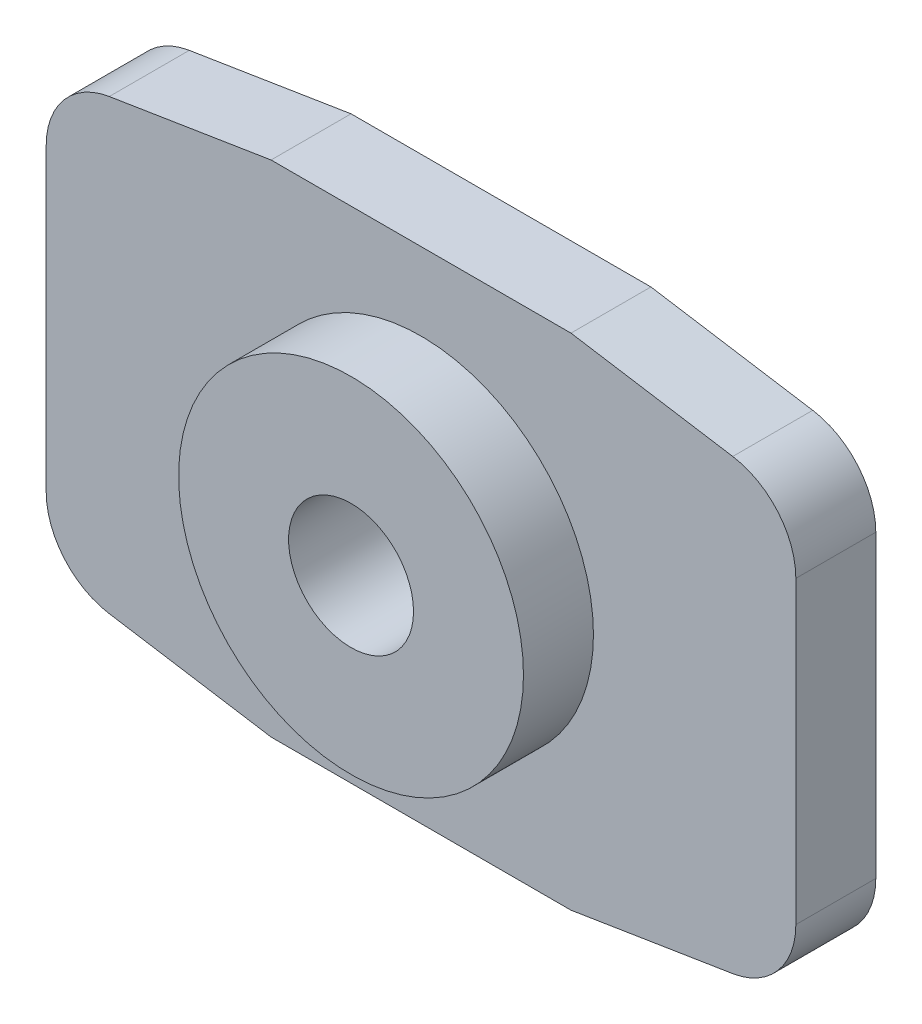
ISO-10303-21;
HEADER;
FILE_DESCRIPTION(('STEP AP214'),'2;1');
FILE_NAME('part.step','',(''),(''),'','','');
FILE_SCHEMA(('AUTOMOTIVE_DESIGN { 1 0 10303 214 1 1 1 1 }'));
ENDSEC;
DATA;
#1=APPLICATION_CONTEXT('core data for automotive mechanical design processes');
#2=APPLICATION_PROTOCOL_DEFINITION('international standard','automotive_design',2000,#1);
#3=PRODUCT_CONTEXT('',#1,'mechanical');
#4=PRODUCT('Part','Part','',(#3));
#5=PRODUCT_RELATED_PRODUCT_CATEGORY('part','',(#4));
#6=PRODUCT_DEFINITION_FORMATION('','',#4);
#7=PRODUCT_DEFINITION_CONTEXT('part definition',#1,'design');
#8=PRODUCT_DEFINITION('design','',#6,#7);
#9=PRODUCT_DEFINITION_SHAPE('','',#8);
#10=(LENGTH_UNIT() NAMED_UNIT(*) SI_UNIT(.MILLI.,.METRE.));
#11=(NAMED_UNIT(*) PLANE_ANGLE_UNIT() SI_UNIT($,.RADIAN.));
#12=(NAMED_UNIT(*) SI_UNIT($,.STERADIAN.) SOLID_ANGLE_UNIT());
#13=UNCERTAINTY_MEASURE_WITH_UNIT(LENGTH_MEASURE(1.E-05),#10,'distance_accuracy_value','');
#14=(GEOMETRIC_REPRESENTATION_CONTEXT(3) GLOBAL_UNCERTAINTY_ASSIGNED_CONTEXT((#13)) GLOBAL_UNIT_ASSIGNED_CONTEXT((#10,
#11,#12)) REPRESENTATION_CONTEXT('',''));
#15=CARTESIAN_POINT('',(0.,0.,0.));
#16=DIRECTION('',(0.,0.,1.));
#17=DIRECTION('',(1.,0.,0.));
#18=AXIS2_PLACEMENT_3D('',#15,#16,#17);
#19=CARTESIAN_POINT('',(6.,3.,1.6));
#20=DIRECTION('',(0.,0.,1.));
#21=DIRECTION('',(1.,0.,0.));
#22=AXIS2_PLACEMENT_3D('',#19,#20,#21);
#23=PLANE('',#22);
#24=CARTESIAN_POINT('',(6.,3.,1.6));
#25=DIRECTION('',(0.,0.,1.));
#26=DIRECTION('',(1.,0.,0.));
#27=AXIS2_PLACEMENT_3D('',#24,#25,#26);
#28=CIRCLE('',#27,1.5);
#29=CARTESIAN_POINT('',(7.5,3.,1.6));
#30=VERTEX_POINT('',#29);
#31=CARTESIAN_POINT('',(6.23739675280407,4.48109512920611,1.6));
#32=VERTEX_POINT('',#31);
#33=EDGE_CURVE('E185',#30,#32,#28,.T.);
#34=ORIENTED_EDGE('',*,*,#33,.T.);
#35=DIRECTION('',(-0.987396752804077,0.158264501869385,0.));
#36=VECTOR('',#35,1.);
#37=CARTESIAN_POINT('',(6.23739675280407,4.48109512920611,1.6));
#38=LINE('',#37,#36);
#39=CARTESIAN_POINT('',(3.,5.,1.6));
#40=VERTEX_POINT('',#39);
#41=EDGE_CURVE('E113',#32,#40,#38,.T.);
#42=ORIENTED_EDGE('',*,*,#41,.T.);
#43=DIRECTION('',(-1.,0.,0.));
#44=VECTOR('',#43,1.);
#45=CARTESIAN_POINT('',(-3.,5.,1.6));
#46=LINE('',#45,#44);
#47=CARTESIAN_POINT('',(-3.,5.,1.6));
#48=VERTEX_POINT('',#47);
#49=EDGE_CURVE('E212',#40,#48,#46,.T.);
#50=ORIENTED_EDGE('',*,*,#49,.T.);
#51=DIRECTION('',(-0.987396752804077,-0.158264501869386,0.));
#52=VECTOR('',#51,1.);
#53=CARTESIAN_POINT('',(-6.23739675280407,4.48109512920611,1.6));
#54=LINE('',#53,#52);
#55=CARTESIAN_POINT('',(-6.23739675280407,4.48109512920611,1.6));
#56=VERTEX_POINT('',#55);
#57=EDGE_CURVE('E230',#48,#56,#54,.T.);
#58=ORIENTED_EDGE('',*,*,#57,.T.);
#59=CARTESIAN_POINT('',(-6.,3.,1.6));
#60=DIRECTION('',(0.,0.,1.));
#61=DIRECTION('',(-1.,0.,0.));
#62=AXIS2_PLACEMENT_3D('',#59,#60,#61);
#63=CIRCLE('',#62,1.5);
#64=CARTESIAN_POINT('',(-7.5,3.,1.6));
#65=VERTEX_POINT('',#64);
#66=EDGE_CURVE('E227',#56,#65,#63,.T.);
#67=ORIENTED_EDGE('',*,*,#66,.T.);
#68=DIRECTION('',(0.,-1.,0.));
#69=VECTOR('',#68,1.);
#70=CARTESIAN_POINT('',(-7.5,-3.,1.6));
#71=LINE('',#70,#69);
#72=CARTESIAN_POINT('',(-7.5,-3.,1.6));
#73=VERTEX_POINT('',#72);
#74=EDGE_CURVE('E229',#65,#73,#71,.T.);
#75=ORIENTED_EDGE('',*,*,#74,.T.);
#76=CARTESIAN_POINT('',(-6.,-3.,1.6));
#77=DIRECTION('',(0.,0.,1.));
#78=DIRECTION('',(1.,0.,0.));
#79=AXIS2_PLACEMENT_3D('',#76,#77,#78);
#80=CIRCLE('',#79,1.5);
#81=CARTESIAN_POINT('',(-6.23739675280407,-4.48109512920612,1.6));
#82=VERTEX_POINT('',#81);
#83=EDGE_CURVE('E232',#73,#82,#80,.T.);
#84=ORIENTED_EDGE('',*,*,#83,.T.);
#85=DIRECTION('',(0.987396752804077,-0.158264501869385,0.));
#86=VECTOR('',#85,1.);
#87=CARTESIAN_POINT('',(-6.23739675280407,-4.48109512920612,1.6));
#88=LINE('',#87,#86);
#89=CARTESIAN_POINT('',(-3.,-5.,1.6));
#90=VERTEX_POINT('',#89);
#91=EDGE_CURVE('E238',#82,#90,#88,.T.);
#92=ORIENTED_EDGE('',*,*,#91,.T.);
#93=DIRECTION('',(1.,0.,0.));
#94=VECTOR('',#93,1.);
#95=CARTESIAN_POINT('',(-3.,-5.,1.6));
#96=LINE('',#95,#94);
#97=CARTESIAN_POINT('',(3.,-5.,1.6));
#98=VERTEX_POINT('',#97);
#99=EDGE_CURVE('E144',#90,#98,#96,.T.);
#100=ORIENTED_EDGE('',*,*,#99,.T.);
#101=DIRECTION('',(0.987396752804077,0.158264501869385,0.));
#102=VECTOR('',#101,1.);
#103=CARTESIAN_POINT('',(6.23739675280407,-4.48109512920611,1.6));
#104=LINE('',#103,#102);
#105=CARTESIAN_POINT('',(6.23739675280407,-4.48109512920612,1.6));
#106=VERTEX_POINT('',#105);
#107=EDGE_CURVE('E138',#98,#106,#104,.T.);
#108=ORIENTED_EDGE('',*,*,#107,.T.);
#109=CARTESIAN_POINT('',(6.,-3.,1.6));
#110=DIRECTION('',(0.,0.,1.));
#111=DIRECTION('',(-1.,0.,0.));
#112=AXIS2_PLACEMENT_3D('',#109,#110,#111);
#113=CIRCLE('',#112,1.5);
#114=CARTESIAN_POINT('',(7.5,-3.,1.6));
#115=VERTEX_POINT('',#114);
#116=EDGE_CURVE('E142',#106,#115,#113,.T.);
#117=ORIENTED_EDGE('',*,*,#116,.T.);
#118=DIRECTION('',(0.,1.,0.));
#119=VECTOR('',#118,1.);
#120=CARTESIAN_POINT('',(7.5,-3.,1.6));
#121=LINE('',#120,#119);
#122=EDGE_CURVE('E58',#115,#30,#121,.T.);
#123=ORIENTED_EDGE('',*,*,#122,.T.);
#124=EDGE_LOOP('',(#34,#42,#50,#58,#67,#75,#84,#92,#100,#108,#117,#123));
#125=FACE_BOUND('',#124,.T.);
#126=CARTESIAN_POINT('',(0.,0.,1.6));
#127=DIRECTION('',(0.,0.,1.));
#128=DIRECTION('',(1.,0.,0.));
#129=AXIS2_PLACEMENT_3D('',#126,#127,#128);
#130=CIRCLE('',#129,3.45);
#131=CARTESIAN_POINT('',(3.45,0.,1.6));
#132=VERTEX_POINT('',#131);
#133=EDGE_CURVE('E290',#132,#132,#130,.T.);
#134=ORIENTED_EDGE('',*,*,#133,.F.);
#135=EDGE_LOOP('',(#134));
#136=FACE_BOUND('',#135,.T.);
#137=ADVANCED_FACE('F41',(#125,#136),#23,.T.);
#138=CARTESIAN_POINT('',(6.,3.,1.6));
#139=DIRECTION('',(0.,0.,-1.));
#140=DIRECTION('',(-1.,0.,0.));
#141=AXIS2_PLACEMENT_3D('',#138,#139,#140);
#142=CYLINDRICAL_SURFACE('',#141,1.5);
#143=CARTESIAN_POINT('',(6.,3.,0.));
#144=DIRECTION('',(0.,0.,1.));
#145=DIRECTION('',(1.,0.,0.));
#146=AXIS2_PLACEMENT_3D('',#143,#144,#145);
#147=CIRCLE('',#146,1.5);
#148=CARTESIAN_POINT('',(7.5,3.,0.));
#149=VERTEX_POINT('',#148);
#150=CARTESIAN_POINT('',(6.23739675280407,4.48109512920611,0.));
#151=VERTEX_POINT('',#150);
#152=EDGE_CURVE('E162',#149,#151,#147,.T.);
#153=ORIENTED_EDGE('',*,*,#152,.T.);
#154=DIRECTION('',(0.,0.,-1.));
#155=VECTOR('',#154,1.);
#156=CARTESIAN_POINT('',(6.23739675280407,4.48109512920611,1.6));
#157=LINE('',#156,#155);
#158=EDGE_CURVE('E11',#32,#151,#157,.T.);
#159=ORIENTED_EDGE('',*,*,#158,.F.);
#160=ORIENTED_EDGE('',*,*,#33,.F.);
#161=DIRECTION('',(0.,0.,-1.));
#162=VECTOR('',#161,1.);
#163=CARTESIAN_POINT('',(7.5,3.,1.6));
#164=LINE('',#163,#162);
#165=EDGE_CURVE('E158',#30,#149,#164,.T.);
#166=ORIENTED_EDGE('',*,*,#165,.T.);
#167=EDGE_LOOP('',(#153,#159,#160,#166));
#168=FACE_BOUND('',#167,.T.);
#169=ADVANCED_FACE('F43',(#168),#142,.T.);
#170=CARTESIAN_POINT('',(6.23739675280407,4.48109512920611,1.6));
#171=DIRECTION('',(-0.158264501869385,-0.987396752804077,0.));
#172=DIRECTION('',(0.987396752804077,-0.158264501869385,0.));
#173=AXIS2_PLACEMENT_3D('',#170,#171,#172);
#174=PLANE('',#173);
#175=DIRECTION('',(-0.987396752804077,0.158264501869385,0.));
#176=VECTOR('',#175,1.);
#177=CARTESIAN_POINT('',(6.23739675280407,4.48109512920611,0.));
#178=LINE('',#177,#176);
#179=CARTESIAN_POINT('',(3.,5.,0.));
#180=VERTEX_POINT('',#179);
#181=EDGE_CURVE('E165',#151,#180,#178,.T.);
#182=ORIENTED_EDGE('',*,*,#181,.T.);
#183=DIRECTION('',(0.,0.,-1.));
#184=VECTOR('',#183,1.);
#185=CARTESIAN_POINT('',(3.,5.,1.6));
#186=LINE('',#185,#184);
#187=EDGE_CURVE('E50',#40,#180,#186,.T.);
#188=ORIENTED_EDGE('',*,*,#187,.F.);
#189=ORIENTED_EDGE('',*,*,#41,.F.);
#190=ORIENTED_EDGE('',*,*,#158,.T.);
#191=EDGE_LOOP('',(#182,#188,#189,#190));
#192=FACE_BOUND('',#191,.T.);
#193=ADVANCED_FACE('F269',(#192),#174,.F.);
#194=CARTESIAN_POINT('',(-3.,5.,1.6));
#195=DIRECTION('',(0.,-1.,0.));
#196=DIRECTION('',(0.,0.,-1.));
#197=AXIS2_PLACEMENT_3D('',#194,#195,#196);
#198=PLANE('',#197);
#199=DIRECTION('',(-1.,0.,0.));
#200=VECTOR('',#199,1.);
#201=CARTESIAN_POINT('',(-3.,5.,0.));
#202=LINE('',#201,#200);
#203=CARTESIAN_POINT('',(-3.,5.,0.));
#204=VERTEX_POINT('',#203);
#205=EDGE_CURVE('E168',#180,#204,#202,.T.);
#206=ORIENTED_EDGE('',*,*,#205,.T.);
#207=DIRECTION('',(0.,0.,-1.));
#208=VECTOR('',#207,1.);
#209=CARTESIAN_POINT('',(-3.,5.,1.6));
#210=LINE('',#209,#208);
#211=EDGE_CURVE('E204',#48,#204,#210,.T.);
#212=ORIENTED_EDGE('',*,*,#211,.F.);
#213=ORIENTED_EDGE('',*,*,#49,.F.);
#214=ORIENTED_EDGE('',*,*,#187,.T.);
#215=EDGE_LOOP('',(#206,#212,#213,#214));
#216=FACE_BOUND('',#215,.T.);
#217=ADVANCED_FACE('F210',(#216),#198,.F.);
#218=CARTESIAN_POINT('',(-6.23739675280407,4.48109512920611,1.6));
#219=DIRECTION('',(0.158264501869386,-0.987396752804077,0.));
#220=DIRECTION('',(0.987396752804077,0.158264501869386,0.));
#221=AXIS2_PLACEMENT_3D('',#218,#219,#220);
#222=PLANE('',#221);
#223=DIRECTION('',(-0.987396752804077,-0.158264501869386,0.));
#224=VECTOR('',#223,1.);
#225=CARTESIAN_POINT('',(-6.23739675280407,4.48109512920611,0.));
#226=LINE('',#225,#224);
#227=CARTESIAN_POINT('',(-6.23739675280407,4.48109512920611,0.));
#228=VERTEX_POINT('',#227);
#229=EDGE_CURVE('E170',#204,#228,#226,.T.);
#230=ORIENTED_EDGE('',*,*,#229,.T.);
#231=DIRECTION('',(0.,0.,-1.));
#232=VECTOR('',#231,1.);
#233=CARTESIAN_POINT('',(-6.23739675280407,4.48109512920611,1.6));
#234=LINE('',#233,#232);
#235=EDGE_CURVE('E201',#56,#228,#234,.T.);
#236=ORIENTED_EDGE('',*,*,#235,.F.);
#237=ORIENTED_EDGE('',*,*,#57,.F.);
#238=ORIENTED_EDGE('',*,*,#211,.T.);
#239=EDGE_LOOP('',(#230,#236,#237,#238));
#240=FACE_BOUND('',#239,.T.);
#241=ADVANCED_FACE('F221',(#240),#222,.F.);
#242=CARTESIAN_POINT('',(-6.,3.,1.6));
#243=DIRECTION('',(0.,0.,-1.));
#244=DIRECTION('',(-1.,0.,0.));
#245=AXIS2_PLACEMENT_3D('',#242,#243,#244);
#246=CYLINDRICAL_SURFACE('',#245,1.5);
#247=CARTESIAN_POINT('',(-6.,3.,0.));
#248=DIRECTION('',(0.,0.,1.));
#249=DIRECTION('',(-1.,0.,0.));
#250=AXIS2_PLACEMENT_3D('',#247,#248,#249);
#251=CIRCLE('',#250,1.5);
#252=CARTESIAN_POINT('',(-7.5,3.,0.));
#253=VERTEX_POINT('',#252);
#254=EDGE_CURVE('E172',#228,#253,#251,.T.);
#255=ORIENTED_EDGE('',*,*,#254,.T.);
#256=DIRECTION('',(0.,0.,-1.));
#257=VECTOR('',#256,1.);
#258=CARTESIAN_POINT('',(-7.5,3.,1.6));
#259=LINE('',#258,#257);
#260=EDGE_CURVE('E198',#65,#253,#259,.T.);
#261=ORIENTED_EDGE('',*,*,#260,.F.);
#262=ORIENTED_EDGE('',*,*,#66,.F.);
#263=ORIENTED_EDGE('',*,*,#235,.T.);
#264=EDGE_LOOP('',(#255,#261,#262,#263));
#265=FACE_BOUND('',#264,.T.);
#266=ADVANCED_FACE('F225',(#265),#246,.T.);
#267=CARTESIAN_POINT('',(-7.5,-3.,1.6));
#268=DIRECTION('',(1.,0.,0.));
#269=DIRECTION('',(0.,0.,-1.));
#270=AXIS2_PLACEMENT_3D('',#267,#268,#269);
#271=PLANE('',#270);
#272=DIRECTION('',(0.,-1.,0.));
#273=VECTOR('',#272,1.);
#274=CARTESIAN_POINT('',(-7.5,-3.,0.));
#275=LINE('',#274,#273);
#276=CARTESIAN_POINT('',(-7.5,-3.,0.));
#277=VERTEX_POINT('',#276);
#278=EDGE_CURVE('E174',#253,#277,#275,.T.);
#279=ORIENTED_EDGE('',*,*,#278,.T.);
#280=DIRECTION('',(0.,0.,-1.));
#281=VECTOR('',#280,1.);
#282=CARTESIAN_POINT('',(-7.5,-3.,1.6));
#283=LINE('',#282,#281);
#284=EDGE_CURVE('E195',#73,#277,#283,.T.);
#285=ORIENTED_EDGE('',*,*,#284,.F.);
#286=ORIENTED_EDGE('',*,*,#74,.F.);
#287=ORIENTED_EDGE('',*,*,#260,.T.);
#288=EDGE_LOOP('',(#279,#285,#286,#287));
#289=FACE_BOUND('',#288,.T.);
#290=ADVANCED_FACE('F348',(#289),#271,.F.);
#291=CARTESIAN_POINT('',(-6.,-3.,1.6));
#292=DIRECTION('',(0.,0.,-1.));
#293=DIRECTION('',(-1.,0.,0.));
#294=AXIS2_PLACEMENT_3D('',#291,#292,#293);
#295=CYLINDRICAL_SURFACE('',#294,1.5);
#296=CARTESIAN_POINT('',(-6.,-3.,0.));
#297=DIRECTION('',(0.,0.,1.));
#298=DIRECTION('',(1.,0.,0.));
#299=AXIS2_PLACEMENT_3D('',#296,#297,#298);
#300=CIRCLE('',#299,1.5);
#301=CARTESIAN_POINT('',(-6.23739675280407,-4.48109512920612,0.));
#302=VERTEX_POINT('',#301);
#303=EDGE_CURVE('E176',#277,#302,#300,.T.);
#304=ORIENTED_EDGE('',*,*,#303,.T.);
#305=DIRECTION('',(0.,0.,-1.));
#306=VECTOR('',#305,1.);
#307=CARTESIAN_POINT('',(-6.23739675280407,-4.48109512920612,1.6));
#308=LINE('',#307,#306);
#309=EDGE_CURVE('E192',#82,#302,#308,.T.);
#310=ORIENTED_EDGE('',*,*,#309,.F.);
#311=ORIENTED_EDGE('',*,*,#83,.F.);
#312=ORIENTED_EDGE('',*,*,#284,.T.);
#313=EDGE_LOOP('',(#304,#310,#311,#312));
#314=FACE_BOUND('',#313,.T.);
#315=ADVANCED_FACE('F341',(#314),#295,.T.);
#316=CARTESIAN_POINT('',(-6.23739675280407,-4.48109512920612,1.6));
#317=DIRECTION('',(0.158264501869385,0.987396752804077,0.));
#318=DIRECTION('',(-0.987396752804077,0.158264501869385,0.));
#319=AXIS2_PLACEMENT_3D('',#316,#317,#318);
#320=PLANE('',#319);
#321=DIRECTION('',(0.987396752804077,-0.158264501869385,0.));
#322=VECTOR('',#321,1.);
#323=CARTESIAN_POINT('',(-6.23739675280407,-4.48109512920612,0.));
#324=LINE('',#323,#322);
#325=CARTESIAN_POINT('',(-3.,-5.,0.));
#326=VERTEX_POINT('',#325);
#327=EDGE_CURVE('E178',#302,#326,#324,.T.);
#328=ORIENTED_EDGE('',*,*,#327,.T.);
#329=DIRECTION('',(0.,0.,-1.));
#330=VECTOR('',#329,1.);
#331=CARTESIAN_POINT('',(-3.,-5.,1.6));
#332=LINE('',#331,#330);
#333=EDGE_CURVE('E189',#90,#326,#332,.T.);
#334=ORIENTED_EDGE('',*,*,#333,.F.);
#335=ORIENTED_EDGE('',*,*,#91,.F.);
#336=ORIENTED_EDGE('',*,*,#309,.T.);
#337=EDGE_LOOP('',(#328,#334,#335,#336));
#338=FACE_BOUND('',#337,.T.);
#339=ADVANCED_FACE('F244',(#338),#320,.F.);
#340=CARTESIAN_POINT('',(-3.,-5.,1.6));
#341=DIRECTION('',(0.,1.,0.));
#342=DIRECTION('',(0.,0.,1.));
#343=AXIS2_PLACEMENT_3D('',#340,#341,#342);
#344=PLANE('',#343);
#345=DIRECTION('',(1.,0.,0.));
#346=VECTOR('',#345,1.);
#347=CARTESIAN_POINT('',(-3.,-5.,0.));
#348=LINE('',#347,#346);
#349=CARTESIAN_POINT('',(3.,-5.,0.));
#350=VERTEX_POINT('',#349);
#351=EDGE_CURVE('E180',#326,#350,#348,.T.);
#352=ORIENTED_EDGE('',*,*,#351,.T.);
#353=DIRECTION('',(0.,0.,-1.));
#354=VECTOR('',#353,1.);
#355=CARTESIAN_POINT('',(3.,-5.,1.6));
#356=LINE('',#355,#354);
#357=EDGE_CURVE('E153',#98,#350,#356,.T.);
#358=ORIENTED_EDGE('',*,*,#357,.F.);
#359=ORIENTED_EDGE('',*,*,#99,.F.);
#360=ORIENTED_EDGE('',*,*,#333,.T.);
#361=EDGE_LOOP('',(#352,#358,#359,#360));
#362=FACE_BOUND('',#361,.T.);
#363=ADVANCED_FACE('F248',(#362),#344,.F.);
#364=CARTESIAN_POINT('',(6.23739675280407,-4.48109512920611,1.6));
#365=DIRECTION('',(-0.158264501869385,0.987396752804077,0.));
#366=DIRECTION('',(-0.987396752804077,-0.158264501869385,0.));
#367=AXIS2_PLACEMENT_3D('',#364,#365,#366);
#368=PLANE('',#367);
#369=DIRECTION('',(0.987396752804077,0.158264501869385,0.));
#370=VECTOR('',#369,1.);
#371=CARTESIAN_POINT('',(6.23739675280407,-4.48109512920611,0.));
#372=LINE('',#371,#370);
#373=CARTESIAN_POINT('',(6.23739675280407,-4.48109512920612,0.));
#374=VERTEX_POINT('',#373);
#375=EDGE_CURVE('E152',#350,#374,#372,.T.);
#376=ORIENTED_EDGE('',*,*,#375,.T.);
#377=DIRECTION('',(0.,0.,-1.));
#378=VECTOR('',#377,1.);
#379=CARTESIAN_POINT('',(6.23739675280407,-4.48109512920612,1.6));
#380=LINE('',#379,#378);
#381=EDGE_CURVE('E149',#106,#374,#380,.T.);
#382=ORIENTED_EDGE('',*,*,#381,.F.);
#383=ORIENTED_EDGE('',*,*,#107,.F.);
#384=ORIENTED_EDGE('',*,*,#357,.T.);
#385=EDGE_LOOP('',(#376,#382,#383,#384));
#386=FACE_BOUND('',#385,.T.);
#387=ADVANCED_FACE('F150',(#386),#368,.F.);
#388=CARTESIAN_POINT('',(6.,-3.,1.6));
#389=DIRECTION('',(0.,0.,-1.));
#390=DIRECTION('',(-1.,0.,0.));
#391=AXIS2_PLACEMENT_3D('',#388,#389,#390);
#392=CYLINDRICAL_SURFACE('',#391,1.5);
#393=CARTESIAN_POINT('',(6.,-3.,0.));
#394=DIRECTION('',(0.,0.,1.));
#395=DIRECTION('',(-1.,0.,0.));
#396=AXIS2_PLACEMENT_3D('',#393,#394,#395);
#397=CIRCLE('',#396,1.5);
#398=CARTESIAN_POINT('',(7.5,-3.,0.));
#399=VERTEX_POINT('',#398);
#400=EDGE_CURVE('E99',#374,#399,#397,.T.);
#401=ORIENTED_EDGE('',*,*,#400,.T.);
#402=DIRECTION('',(0.,0.,-1.));
#403=VECTOR('',#402,1.);
#404=CARTESIAN_POINT('',(7.5,-3.,1.6));
#405=LINE('',#404,#403);
#406=EDGE_CURVE('E154',#115,#399,#405,.T.);
#407=ORIENTED_EDGE('',*,*,#406,.F.);
#408=ORIENTED_EDGE('',*,*,#116,.F.);
#409=ORIENTED_EDGE('',*,*,#381,.T.);
#410=EDGE_LOOP('',(#401,#407,#408,#409));
#411=FACE_BOUND('',#410,.T.);
#412=ADVANCED_FACE('F156',(#411),#392,.T.);
#413=CARTESIAN_POINT('',(7.5,-3.,1.6));
#414=DIRECTION('',(-1.,0.,0.));
#415=DIRECTION('',(0.,-1.,0.));
#416=AXIS2_PLACEMENT_3D('',#413,#414,#415);
#417=PLANE('',#416);
#418=DIRECTION('',(0.,1.,0.));
#419=VECTOR('',#418,1.);
#420=CARTESIAN_POINT('',(7.5,-3.,0.));
#421=LINE('',#420,#419);
#422=EDGE_CURVE('E105',#399,#149,#421,.T.);
#423=ORIENTED_EDGE('',*,*,#422,.T.);
#424=ORIENTED_EDGE('',*,*,#165,.F.);
#425=ORIENTED_EDGE('',*,*,#122,.F.);
#426=ORIENTED_EDGE('',*,*,#406,.T.);
#427=EDGE_LOOP('',(#423,#424,#425,#426));
#428=FACE_BOUND('',#427,.T.);
#429=ADVANCED_FACE('F252',(#428),#417,.F.);
#430=CARTESIAN_POINT('',(6.,3.,0.));
#431=DIRECTION('',(0.,0.,1.));
#432=DIRECTION('',(1.,0.,0.));
#433=AXIS2_PLACEMENT_3D('',#430,#431,#432);
#434=PLANE('',#433);
#435=CARTESIAN_POINT('',(0.,0.,0.));
#436=DIRECTION('',(0.,0.,1.));
#437=DIRECTION('',(1.,0.,0.));
#438=AXIS2_PLACEMENT_3D('',#435,#436,#437);
#439=CIRCLE('',#438,1.25);
#440=CARTESIAN_POINT('',(1.25,0.,0.));
#441=VERTEX_POINT('',#440);
#442=EDGE_CURVE('E285',#441,#441,#439,.T.);
#443=ORIENTED_EDGE('',*,*,#442,.T.);
#444=EDGE_LOOP('',(#443));
#445=FACE_BOUND('',#444,.T.);
#446=ORIENTED_EDGE('',*,*,#152,.F.);
#447=ORIENTED_EDGE('',*,*,#422,.F.);
#448=ORIENTED_EDGE('',*,*,#400,.F.);
#449=ORIENTED_EDGE('',*,*,#375,.F.);
#450=ORIENTED_EDGE('',*,*,#351,.F.);
#451=ORIENTED_EDGE('',*,*,#327,.F.);
#452=ORIENTED_EDGE('',*,*,#303,.F.);
#453=ORIENTED_EDGE('',*,*,#278,.F.);
#454=ORIENTED_EDGE('',*,*,#254,.F.);
#455=ORIENTED_EDGE('',*,*,#229,.F.);
#456=ORIENTED_EDGE('',*,*,#205,.F.);
#457=ORIENTED_EDGE('',*,*,#181,.F.);
#458=EDGE_LOOP('',(#446,#447,#448,#449,#450,#451,#452,#453,#454,#455,#456,#457));
#459=FACE_BOUND('',#458,.T.);
#460=ADVANCED_FACE('F216',(#445,#459),#434,.F.);
#461=CARTESIAN_POINT('',(0.,0.,3.));
#462=DIRECTION('',(0.,0.,-1.));
#463=DIRECTION('',(-1.,0.,0.));
#464=AXIS2_PLACEMENT_3D('',#461,#462,#463);
#465=CYLINDRICAL_SURFACE('',#464,3.45);
#466=CARTESIAN_POINT('',(0.,0.,3.));
#467=DIRECTION('',(0.,0.,1.));
#468=DIRECTION('',(1.,0.,0.));
#469=AXIS2_PLACEMENT_3D('',#466,#467,#468);
#470=CIRCLE('',#469,3.45);
#471=CARTESIAN_POINT('',(3.45,0.,3.));
#472=VERTEX_POINT('',#471);
#473=EDGE_CURVE('E166',#472,#472,#470,.T.);
#474=ORIENTED_EDGE('',*,*,#473,.F.);
#475=EDGE_LOOP('',(#474));
#476=FACE_BOUND('',#475,.T.);
#477=ORIENTED_EDGE('',*,*,#133,.T.);
#478=EDGE_LOOP('',(#477));
#479=FACE_BOUND('',#478,.T.);
#480=ADVANCED_FACE('F260',(#476,#479),#465,.T.);
#481=CARTESIAN_POINT('',(0.,0.,3.));
#482=DIRECTION('',(0.,0.,1.));
#483=DIRECTION('',(1.,0.,0.));
#484=AXIS2_PLACEMENT_3D('',#481,#482,#483);
#485=PLANE('',#484);
#486=CARTESIAN_POINT('',(0.,0.,3.));
#487=DIRECTION('',(0.,0.,1.));
#488=DIRECTION('',(1.,0.,0.));
#489=AXIS2_PLACEMENT_3D('',#486,#487,#488);
#490=CIRCLE('',#489,1.25);
#491=CARTESIAN_POINT('',(1.25,0.,3.));
#492=VERTEX_POINT('',#491);
#493=EDGE_CURVE('E288',#492,#492,#490,.T.);
#494=ORIENTED_EDGE('',*,*,#493,.F.);
#495=EDGE_LOOP('',(#494));
#496=FACE_BOUND('',#495,.T.);
#497=ORIENTED_EDGE('',*,*,#473,.T.);
#498=EDGE_LOOP('',(#497));
#499=FACE_BOUND('',#498,.T.);
#500=ADVANCED_FACE('F272',(#496,#499),#485,.T.);
#501=CARTESIAN_POINT('',(0.,0.,3.));
#502=DIRECTION('',(0.,0.,1.));
#503=DIRECTION('',(1.,0.,0.));
#504=AXIS2_PLACEMENT_3D('',#501,#502,#503);
#505=CYLINDRICAL_SURFACE('',#504,1.25);
#506=ORIENTED_EDGE('',*,*,#442,.F.);
#507=EDGE_LOOP('',(#506));
#508=FACE_BOUND('',#507,.T.);
#509=ORIENTED_EDGE('',*,*,#493,.T.);
#510=EDGE_LOOP('',(#509));
#511=FACE_BOUND('',#510,.T.);
#512=ADVANCED_FACE('F276',(#508,#511),#505,.F.);
#513=CLOSED_SHELL('',(#137,#169,#193,#217,#241,#266,#290,#315,#339,#363,#387,#412,#429,#460,
#480,#500,#512));
#514=MANIFOLD_SOLID_BREP('B2',#513);
#515=ADVANCED_BREP_SHAPE_REPRESENTATION('',(#18,#514),#14);
#516=SHAPE_DEFINITION_REPRESENTATION(#9,#515);
ENDSEC;
END-ISO-10303-21;
